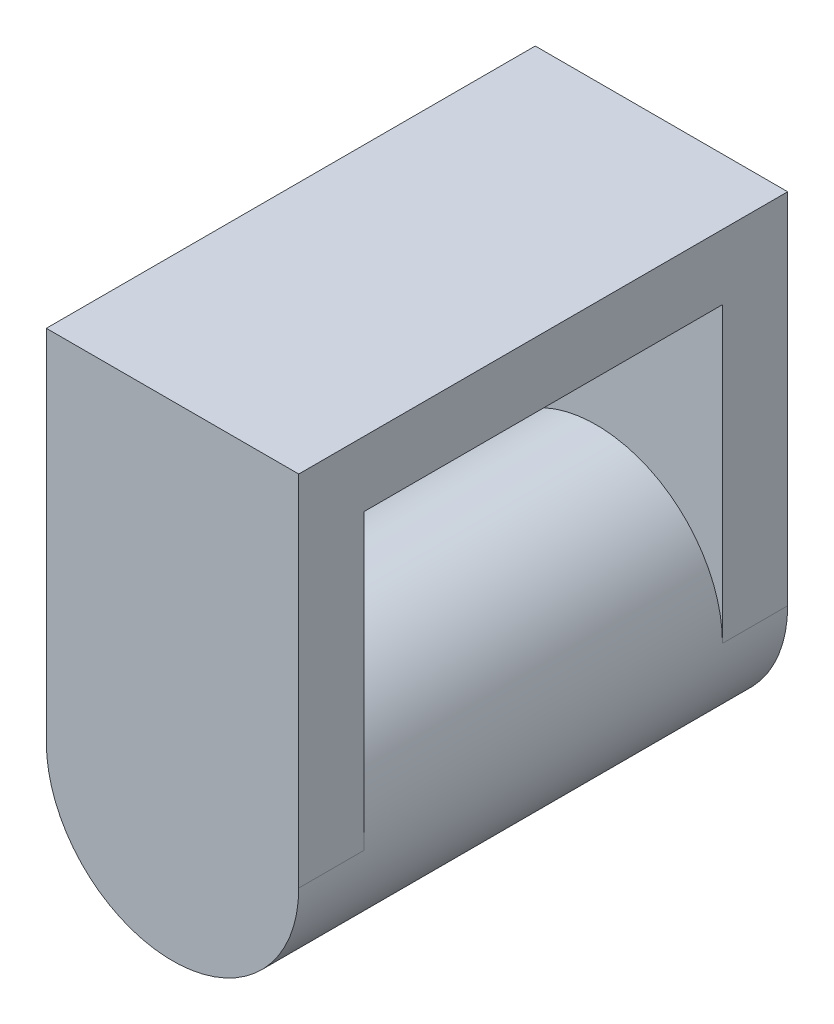
ISO-10303-21;
HEADER;
FILE_DESCRIPTION(('STEP AP214'),'2;1');
FILE_NAME('part.step','',(''),(''),'','','');
FILE_SCHEMA(('AUTOMOTIVE_DESIGN { 1 0 10303 214 1 1 1 1 }'));
ENDSEC;
DATA;
#1=APPLICATION_CONTEXT('core data for automotive mechanical design processes');
#2=APPLICATION_PROTOCOL_DEFINITION('international standard','automotive_design',2000,#1);
#3=PRODUCT_CONTEXT('',#1,'mechanical');
#4=PRODUCT('Part','Part','',(#3));
#5=PRODUCT_RELATED_PRODUCT_CATEGORY('part','',(#4));
#6=PRODUCT_DEFINITION_FORMATION('','',#4);
#7=PRODUCT_DEFINITION_CONTEXT('part definition',#1,'design');
#8=PRODUCT_DEFINITION('design','',#6,#7);
#9=PRODUCT_DEFINITION_SHAPE('','',#8);
#10=(LENGTH_UNIT() NAMED_UNIT(*) SI_UNIT(.MILLI.,.METRE.));
#11=(NAMED_UNIT(*) PLANE_ANGLE_UNIT() SI_UNIT($,.RADIAN.));
#12=(NAMED_UNIT(*) SI_UNIT($,.STERADIAN.) SOLID_ANGLE_UNIT());
#13=UNCERTAINTY_MEASURE_WITH_UNIT(LENGTH_MEASURE(1.E-05),#10,'distance_accuracy_value','');
#14=(GEOMETRIC_REPRESENTATION_CONTEXT(3) GLOBAL_UNCERTAINTY_ASSIGNED_CONTEXT((#13)) GLOBAL_UNIT_ASSIGNED_CONTEXT((#10,
#11,#12)) REPRESENTATION_CONTEXT('',''));
#15=CARTESIAN_POINT('',(0.,0.,0.));
#16=DIRECTION('',(0.,0.,1.));
#17=DIRECTION('',(1.,0.,0.));
#18=AXIS2_PLACEMENT_3D('',#15,#16,#17);
#19=CARTESIAN_POINT('',(0.,0.,8.73125));
#20=DIRECTION('',(0.,0.,-1.));
#21=DIRECTION('',(-1.,0.,0.));
#22=AXIS2_PLACEMENT_3D('',#19,#20,#21);
#23=PLANE('',#22);
#24=DIRECTION('',(0.,-1.,0.));
#25=VECTOR('',#24,1.);
#26=CARTESIAN_POINT('',(-6.1468,0.,8.73125));
#27=LINE('',#26,#25);
#28=CARTESIAN_POINT('',(-6.1468,14.2875,8.73125));
#29=VERTEX_POINT('',#28);
#30=CARTESIAN_POINT('',(-6.1468,0.,8.73125));
#31=VERTEX_POINT('',#30);
#32=EDGE_CURVE('E145',#29,#31,#27,.T.);
#33=ORIENTED_EDGE('',*,*,#32,.F.);
#34=DIRECTION('',(1.,0.,0.));
#35=VECTOR('',#34,1.);
#36=CARTESIAN_POINT('',(-6.1468,14.2875,8.73125));
#37=LINE('',#36,#35);
#38=CARTESIAN_POINT('',(6.1468,14.2875,8.73125));
#39=VERTEX_POINT('',#38);
#40=EDGE_CURVE('E139',#29,#39,#37,.T.);
#41=ORIENTED_EDGE('',*,*,#40,.T.);
#42=DIRECTION('',(0.,1.,0.));
#43=VECTOR('',#42,1.);
#44=CARTESIAN_POINT('',(6.1468,17.4625,8.73125));
#45=LINE('',#44,#43);
#46=CARTESIAN_POINT('',(6.1468,0.,8.73125));
#47=VERTEX_POINT('',#46);
#48=EDGE_CURVE('E167',#47,#39,#45,.T.);
#49=ORIENTED_EDGE('',*,*,#48,.F.);
#50=CARTESIAN_POINT('',(0.,0.,8.73125));
#51=DIRECTION('',(0.,0.,1.));
#52=DIRECTION('',(1.,0.,0.));
#53=AXIS2_PLACEMENT_3D('',#50,#51,#52);
#54=CIRCLE('',#53,6.1468);
#55=EDGE_CURVE('E11',#47,#31,#54,.T.);
#56=ORIENTED_EDGE('',*,*,#55,.T.);
#57=EDGE_LOOP('',(#33,#41,#49,#56));
#58=FACE_BOUND('',#57,.T.);
#59=ADVANCED_FACE('F33',(#58),#23,.T.);
#60=CARTESIAN_POINT('',(0.,0.,8.73125));
#61=DIRECTION('',(0.,0.,-1.));
#62=DIRECTION('',(-1.,0.,0.));
#63=AXIS2_PLACEMENT_3D('',#60,#61,#62);
#64=CYLINDRICAL_SURFACE('',#63,6.1468);
#65=ORIENTED_EDGE('',*,*,#55,.F.);
#66=DIRECTION('',(0.,0.,-1.));
#67=VECTOR('',#66,1.);
#68=CARTESIAN_POINT('',(6.1468,0.,11.90625));
#69=LINE('',#68,#67);
#70=CARTESIAN_POINT('',(6.1468,0.,11.90625));
#71=VERTEX_POINT('',#70);
#72=EDGE_CURVE('E144',#71,#47,#69,.T.);
#73=ORIENTED_EDGE('',*,*,#72,.F.);
#74=CARTESIAN_POINT('',(0.,0.,11.90625));
#75=DIRECTION('',(0.,0.,1.));
#76=DIRECTION('',(-1.,0.,0.));
#77=AXIS2_PLACEMENT_3D('',#74,#75,#76);
#78=CIRCLE('',#77,6.1468);
#79=CARTESIAN_POINT('',(-6.1468,0.,11.90625));
#80=VERTEX_POINT('',#79);
#81=EDGE_CURVE('E152',#80,#71,#78,.T.);
#82=ORIENTED_EDGE('',*,*,#81,.F.);
#83=DIRECTION('',(0.,0.,-1.));
#84=VECTOR('',#83,1.);
#85=CARTESIAN_POINT('',(-6.1468,0.,11.90625));
#86=LINE('',#85,#84);
#87=EDGE_CURVE('E161',#80,#31,#86,.T.);
#88=ORIENTED_EDGE('',*,*,#87,.T.);
#89=EDGE_LOOP('',(#65,#73,#82,#88));
#90=FACE_BOUND('',#89,.T.);
#91=CARTESIAN_POINT('',(0.,0.,-8.73125));
#92=DIRECTION('',(0.,0.,1.));
#93=DIRECTION('',(1.,0.,0.));
#94=AXIS2_PLACEMENT_3D('',#91,#92,#93);
#95=CIRCLE('',#94,6.1468);
#96=CARTESIAN_POINT('',(6.1468,0.,-8.73125));
#97=VERTEX_POINT('',#96);
#98=CARTESIAN_POINT('',(-6.1468,0.,-8.73125));
#99=VERTEX_POINT('',#98);
#100=EDGE_CURVE('E42',#97,#99,#95,.T.);
#101=ORIENTED_EDGE('',*,*,#100,.T.);
#102=DIRECTION('',(0.,0.,1.));
#103=VECTOR('',#102,1.);
#104=CARTESIAN_POINT('',(-6.1468,0.,-11.90625));
#105=LINE('',#104,#103);
#106=CARTESIAN_POINT('',(-6.1468,0.,-11.90625));
#107=VERTEX_POINT('',#106);
#108=EDGE_CURVE('E102',#107,#99,#105,.T.);
#109=ORIENTED_EDGE('',*,*,#108,.F.);
#110=CARTESIAN_POINT('',(0.,0.,-11.90625));
#111=DIRECTION('',(0.,0.,1.));
#112=DIRECTION('',(-1.,0.,0.));
#113=AXIS2_PLACEMENT_3D('',#110,#111,#112);
#114=CIRCLE('',#113,6.1468);
#115=CARTESIAN_POINT('',(6.1468,0.,-11.90625));
#116=VERTEX_POINT('',#115);
#117=EDGE_CURVE('E104',#107,#116,#114,.T.);
#118=ORIENTED_EDGE('',*,*,#117,.T.);
#119=DIRECTION('',(0.,0.,1.));
#120=VECTOR('',#119,1.);
#121=CARTESIAN_POINT('',(6.1468,0.,-11.90625));
#122=LINE('',#121,#120);
#123=EDGE_CURVE('E111',#116,#97,#122,.T.);
#124=ORIENTED_EDGE('',*,*,#123,.T.);
#125=EDGE_LOOP('',(#101,#109,#118,#124));
#126=FACE_BOUND('',#125,.T.);
#127=ADVANCED_FACE('F35',(#90,#126),#64,.T.);
#128=CARTESIAN_POINT('',(6.1468,17.4625,11.90625));
#129=DIRECTION('',(-1.,0.,0.));
#130=DIRECTION('',(0.,-1.,0.));
#131=AXIS2_PLACEMENT_3D('',#128,#129,#130);
#132=PLANE('',#131);
#133=ORIENTED_EDGE('',*,*,#48,.T.);
#134=DIRECTION('',(0.,0.,-1.));
#135=VECTOR('',#134,1.);
#136=CARTESIAN_POINT('',(6.1468,14.2875,8.73125));
#137=LINE('',#136,#135);
#138=CARTESIAN_POINT('',(6.1468,14.2875,-8.73125));
#139=VERTEX_POINT('',#138);
#140=EDGE_CURVE('E57',#39,#139,#137,.T.);
#141=ORIENTED_EDGE('',*,*,#140,.T.);
#142=DIRECTION('',(0.,1.,0.));
#143=VECTOR('',#142,1.);
#144=CARTESIAN_POINT('',(6.1468,17.4625,-8.73125));
#145=LINE('',#144,#143);
#146=EDGE_CURVE('E50',#97,#139,#145,.T.);
#147=ORIENTED_EDGE('',*,*,#146,.F.);
#148=ORIENTED_EDGE('',*,*,#123,.F.);
#149=DIRECTION('',(0.,1.,0.));
#150=VECTOR('',#149,1.);
#151=CARTESIAN_POINT('',(6.1468,17.4625,-11.90625));
#152=LINE('',#151,#150);
#153=CARTESIAN_POINT('',(6.1468,17.4625,-11.90625));
#154=VERTEX_POINT('',#153);
#155=EDGE_CURVE('E119',#116,#154,#152,.T.);
#156=ORIENTED_EDGE('',*,*,#155,.T.);
#157=DIRECTION('',(0.,0.,-1.));
#158=VECTOR('',#157,1.);
#159=CARTESIAN_POINT('',(6.1468,17.4625,11.90625));
#160=LINE('',#159,#158);
#161=CARTESIAN_POINT('',(6.1468,17.4625,11.90625));
#162=VERTEX_POINT('',#161);
#163=EDGE_CURVE('E163',#162,#154,#160,.T.);
#164=ORIENTED_EDGE('',*,*,#163,.F.);
#165=DIRECTION('',(0.,1.,0.));
#166=VECTOR('',#165,1.);
#167=CARTESIAN_POINT('',(6.1468,17.4625,11.90625));
#168=LINE('',#167,#166);
#169=EDGE_CURVE('E155',#71,#162,#168,.T.);
#170=ORIENTED_EDGE('',*,*,#169,.F.);
#171=ORIENTED_EDGE('',*,*,#72,.T.);
#172=EDGE_LOOP('',(#133,#141,#147,#148,#156,#164,#170,#171));
#173=FACE_BOUND('',#172,.T.);
#174=ADVANCED_FACE('F188',(#173),#132,.F.);
#175=CARTESIAN_POINT('',(-6.1468,17.4625,11.90625));
#176=DIRECTION('',(0.,-1.,0.));
#177=DIRECTION('',(0.,0.,-1.));
#178=AXIS2_PLACEMENT_3D('',#175,#176,#177);
#179=PLANE('',#178);
#180=ORIENTED_EDGE('',*,*,#163,.T.);
#181=DIRECTION('',(-1.,0.,0.));
#182=VECTOR('',#181,1.);
#183=CARTESIAN_POINT('',(-6.1468,17.4625,-11.90625));
#184=LINE('',#183,#182);
#185=CARTESIAN_POINT('',(-6.1468,17.4625,-11.90625));
#186=VERTEX_POINT('',#185);
#187=EDGE_CURVE('E125',#154,#186,#184,.T.);
#188=ORIENTED_EDGE('',*,*,#187,.T.);
#189=DIRECTION('',(0.,0.,-1.));
#190=VECTOR('',#189,1.);
#191=CARTESIAN_POINT('',(-6.1468,17.4625,11.90625));
#192=LINE('',#191,#190);
#193=CARTESIAN_POINT('',(-6.1468,17.4625,11.90625));
#194=VERTEX_POINT('',#193);
#195=EDGE_CURVE('E124',#194,#186,#192,.T.);
#196=ORIENTED_EDGE('',*,*,#195,.F.);
#197=DIRECTION('',(-1.,0.,0.));
#198=VECTOR('',#197,1.);
#199=CARTESIAN_POINT('',(-6.1468,17.4625,11.90625));
#200=LINE('',#199,#198);
#201=EDGE_CURVE('E157',#162,#194,#200,.T.);
#202=ORIENTED_EDGE('',*,*,#201,.F.);
#203=EDGE_LOOP('',(#180,#188,#196,#202));
#204=FACE_BOUND('',#203,.T.);
#205=ADVANCED_FACE('F194',(#204),#179,.F.);
#206=CARTESIAN_POINT('',(-6.1468,0.,11.90625));
#207=DIRECTION('',(1.,0.,0.));
#208=DIRECTION('',(0.,0.,-1.));
#209=AXIS2_PLACEMENT_3D('',#206,#207,#208);
#210=PLANE('',#209);
#211=ORIENTED_EDGE('',*,*,#195,.T.);
#212=DIRECTION('',(0.,-1.,0.));
#213=VECTOR('',#212,1.);
#214=CARTESIAN_POINT('',(-6.1468,0.,-11.90625));
#215=LINE('',#214,#213);
#216=EDGE_CURVE('E116',#186,#107,#215,.T.);
#217=ORIENTED_EDGE('',*,*,#216,.T.);
#218=ORIENTED_EDGE('',*,*,#108,.T.);
#219=DIRECTION('',(0.,-1.,0.));
#220=VECTOR('',#219,1.);
#221=CARTESIAN_POINT('',(-6.1468,0.,-8.73125));
#222=LINE('',#221,#220);
#223=CARTESIAN_POINT('',(-6.1468,14.2875,-8.73125));
#224=VERTEX_POINT('',#223);
#225=EDGE_CURVE('E135',#224,#99,#222,.T.);
#226=ORIENTED_EDGE('',*,*,#225,.F.);
#227=DIRECTION('',(0.,0.,-1.));
#228=VECTOR('',#227,1.);
#229=CARTESIAN_POINT('',(-6.1468,14.2875,8.73125));
#230=LINE('',#229,#228);
#231=EDGE_CURVE('E170',#29,#224,#230,.T.);
#232=ORIENTED_EDGE('',*,*,#231,.F.);
#233=ORIENTED_EDGE('',*,*,#32,.T.);
#234=ORIENTED_EDGE('',*,*,#87,.F.);
#235=DIRECTION('',(0.,-1.,0.));
#236=VECTOR('',#235,1.);
#237=CARTESIAN_POINT('',(-6.1468,0.,11.90625));
#238=LINE('',#237,#236);
#239=EDGE_CURVE('E159',#194,#80,#238,.T.);
#240=ORIENTED_EDGE('',*,*,#239,.F.);
#241=EDGE_LOOP('',(#211,#217,#218,#226,#232,#233,#234,#240));
#242=FACE_BOUND('',#241,.T.);
#243=ADVANCED_FACE('F121',(#242),#210,.F.);
#244=CARTESIAN_POINT('',(0.,0.,11.90625));
#245=DIRECTION('',(0.,0.,-1.));
#246=DIRECTION('',(-1.,0.,0.));
#247=AXIS2_PLACEMENT_3D('',#244,#245,#246);
#248=PLANE('',#247);
#249=ORIENTED_EDGE('',*,*,#81,.T.);
#250=ORIENTED_EDGE('',*,*,#169,.T.);
#251=ORIENTED_EDGE('',*,*,#201,.T.);
#252=ORIENTED_EDGE('',*,*,#239,.T.);
#253=EDGE_LOOP('',(#249,#250,#251,#252));
#254=FACE_BOUND('',#253,.T.);
#255=ADVANCED_FACE('F192',(#254),#248,.F.);
#256=CARTESIAN_POINT('',(-6.1468,14.2875,8.73125));
#257=DIRECTION('',(0.,1.,0.));
#258=DIRECTION('',(0.,0.,1.));
#259=AXIS2_PLACEMENT_3D('',#256,#257,#258);
#260=PLANE('',#259);
#261=DIRECTION('',(1.,0.,0.));
#262=VECTOR('',#261,1.);
#263=CARTESIAN_POINT('',(-6.1468,14.2875,-8.73125));
#264=LINE('',#263,#262);
#265=EDGE_CURVE('E110',#224,#139,#264,.T.);
#266=ORIENTED_EDGE('',*,*,#265,.T.);
#267=ORIENTED_EDGE('',*,*,#140,.F.);
#268=ORIENTED_EDGE('',*,*,#40,.F.);
#269=ORIENTED_EDGE('',*,*,#231,.T.);
#270=EDGE_LOOP('',(#266,#267,#268,#269));
#271=FACE_BOUND('',#270,.T.);
#272=ADVANCED_FACE('F202',(#271),#260,.F.);
#273=CARTESIAN_POINT('',(0.,0.,-8.73125));
#274=DIRECTION('',(0.,0.,1.));
#275=DIRECTION('',(-1.,0.,0.));
#276=AXIS2_PLACEMENT_3D('',#273,#274,#275);
#277=PLANE('',#276);
#278=ORIENTED_EDGE('',*,*,#100,.F.);
#279=ORIENTED_EDGE('',*,*,#146,.T.);
#280=ORIENTED_EDGE('',*,*,#265,.F.);
#281=ORIENTED_EDGE('',*,*,#225,.T.);
#282=EDGE_LOOP('',(#278,#279,#280,#281));
#283=FACE_BOUND('',#282,.T.);
#284=ADVANCED_FACE('F204',(#283),#277,.T.);
#285=CARTESIAN_POINT('',(0.,0.,-11.90625));
#286=DIRECTION('',(0.,0.,1.));
#287=DIRECTION('',(-1.,0.,0.));
#288=AXIS2_PLACEMENT_3D('',#285,#286,#287);
#289=PLANE('',#288);
#290=ORIENTED_EDGE('',*,*,#117,.F.);
#291=ORIENTED_EDGE('',*,*,#216,.F.);
#292=ORIENTED_EDGE('',*,*,#187,.F.);
#293=ORIENTED_EDGE('',*,*,#155,.F.);
#294=EDGE_LOOP('',(#290,#291,#292,#293));
#295=FACE_BOUND('',#294,.T.);
#296=ADVANCED_FACE('F114',(#295),#289,.F.);
#297=CLOSED_SHELL('',(#59,#127,#174,#205,#243,#255,#272,#284,#296));
#298=MANIFOLD_SOLID_BREP('B2',#297);
#299=ADVANCED_BREP_SHAPE_REPRESENTATION('',(#18,#298),#14);
#300=SHAPE_DEFINITION_REPRESENTATION(#9,#299);
ENDSEC;
END-ISO-10303-21;
